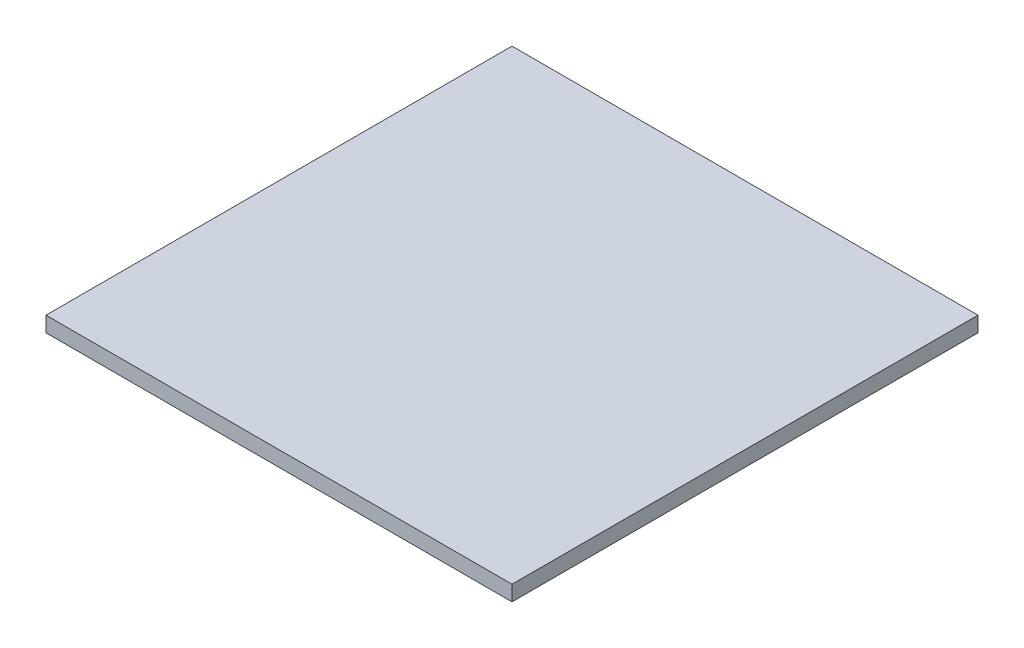
ISO-10303-21;
HEADER;
FILE_DESCRIPTION(('STEP AP214'),'2;1');
FILE_NAME('part.step','',(''),(''),'','','');
FILE_SCHEMA(('AUTOMOTIVE_DESIGN { 1 0 10303 214 1 1 1 1 }'));
ENDSEC;
DATA;
#1=APPLICATION_CONTEXT('core data for automotive mechanical design processes');
#2=APPLICATION_PROTOCOL_DEFINITION('international standard','automotive_design',2000,#1);
#3=PRODUCT_CONTEXT('',#1,'mechanical');
#4=PRODUCT('Part','Part','',(#3));
#5=PRODUCT_RELATED_PRODUCT_CATEGORY('part','',(#4));
#6=PRODUCT_DEFINITION_FORMATION('','',#4);
#7=PRODUCT_DEFINITION_CONTEXT('part definition',#1,'design');
#8=PRODUCT_DEFINITION('design','',#6,#7);
#9=PRODUCT_DEFINITION_SHAPE('','',#8);
#10=(LENGTH_UNIT() NAMED_UNIT(*) SI_UNIT(.MILLI.,.METRE.));
#11=(NAMED_UNIT(*) PLANE_ANGLE_UNIT() SI_UNIT($,.RADIAN.));
#12=(NAMED_UNIT(*) SI_UNIT($,.STERADIAN.) SOLID_ANGLE_UNIT());
#13=UNCERTAINTY_MEASURE_WITH_UNIT(LENGTH_MEASURE(1.E-05),#10,'distance_accuracy_value','');
#14=(GEOMETRIC_REPRESENTATION_CONTEXT(3) GLOBAL_UNCERTAINTY_ASSIGNED_CONTEXT((#13)) GLOBAL_UNIT_ASSIGNED_CONTEXT((#10,
#11,#12)) REPRESENTATION_CONTEXT('',''));
#15=CARTESIAN_POINT('',(0.,0.,0.));
#16=DIRECTION('',(0.,0.,1.));
#17=DIRECTION('',(1.,0.,0.));
#18=AXIS2_PLACEMENT_3D('',#15,#16,#17);
#19=CARTESIAN_POINT('',(152.4,10.,152.4));
#20=DIRECTION('',(-1.,0.,0.));
#21=DIRECTION('',(0.,0.,1.));
#22=AXIS2_PLACEMENT_3D('',#19,#20,#21);
#23=PLANE('',#22);
#24=DIRECTION('',(0.,0.,-1.));
#25=VECTOR('',#24,1.);
#26=CARTESIAN_POINT('',(152.4,0.,152.4));
#27=LINE('',#26,#25);
#28=CARTESIAN_POINT('',(152.4,0.,152.4));
#29=VERTEX_POINT('',#28);
#30=CARTESIAN_POINT('',(152.4,0.,-152.4));
#31=VERTEX_POINT('',#30);
#32=EDGE_CURVE('E104',#29,#31,#27,.T.);
#33=ORIENTED_EDGE('',*,*,#32,.T.);
#34=DIRECTION('',(0.,-1.,0.));
#35=VECTOR('',#34,1.);
#36=CARTESIAN_POINT('',(152.4,10.,-152.4));
#37=LINE('',#36,#35);
#38=CARTESIAN_POINT('',(152.4,10.,-152.4));
#39=VERTEX_POINT('',#38);
#40=EDGE_CURVE('E11',#39,#31,#37,.T.);
#41=ORIENTED_EDGE('',*,*,#40,.F.);
#42=DIRECTION('',(0.,0.,-1.));
#43=VECTOR('',#42,1.);
#44=CARTESIAN_POINT('',(152.4,10.,152.4));
#45=LINE('',#44,#43);
#46=CARTESIAN_POINT('',(152.4,10.,152.4));
#47=VERTEX_POINT('',#46);
#48=EDGE_CURVE('E92',#47,#39,#45,.T.);
#49=ORIENTED_EDGE('',*,*,#48,.F.);
#50=DIRECTION('',(0.,-1.,0.));
#51=VECTOR('',#50,1.);
#52=CARTESIAN_POINT('',(152.4,10.,152.4));
#53=LINE('',#52,#51);
#54=EDGE_CURVE('E100',#47,#29,#53,.T.);
#55=ORIENTED_EDGE('',*,*,#54,.T.);
#56=EDGE_LOOP('',(#33,#41,#49,#55));
#57=FACE_BOUND('',#56,.T.);
#58=ADVANCED_FACE('F41',(#57),#23,.F.);
#59=CARTESIAN_POINT('',(-152.4,10.,-152.4));
#60=DIRECTION('',(0.,0.,1.));
#61=DIRECTION('',(1.,0.,0.));
#62=AXIS2_PLACEMENT_3D('',#59,#60,#61);
#63=PLANE('',#62);
#64=DIRECTION('',(-1.,0.,0.));
#65=VECTOR('',#64,1.);
#66=CARTESIAN_POINT('',(-152.4,0.,-152.4));
#67=LINE('',#66,#65);
#68=CARTESIAN_POINT('',(-152.4,0.,-152.4));
#69=VERTEX_POINT('',#68);
#70=EDGE_CURVE('E96',#31,#69,#67,.T.);
#71=ORIENTED_EDGE('',*,*,#70,.T.);
#72=DIRECTION('',(0.,-1.,0.));
#73=VECTOR('',#72,1.);
#74=CARTESIAN_POINT('',(-152.4,10.,-152.4));
#75=LINE('',#74,#73);
#76=CARTESIAN_POINT('',(-152.4,10.,-152.4));
#77=VERTEX_POINT('',#76);
#78=EDGE_CURVE('E49',#77,#69,#75,.T.);
#79=ORIENTED_EDGE('',*,*,#78,.F.);
#80=DIRECTION('',(-1.,0.,0.));
#81=VECTOR('',#80,1.);
#82=CARTESIAN_POINT('',(-152.4,10.,-152.4));
#83=LINE('',#82,#81);
#84=EDGE_CURVE('E87',#39,#77,#83,.T.);
#85=ORIENTED_EDGE('',*,*,#84,.F.);
#86=ORIENTED_EDGE('',*,*,#40,.T.);
#87=EDGE_LOOP('',(#71,#79,#85,#86));
#88=FACE_BOUND('',#87,.T.);
#89=ADVANCED_FACE('F95',(#88),#63,.F.);
#90=CARTESIAN_POINT('',(-152.4,10.,152.4));
#91=DIRECTION('',(1.,0.,0.));
#92=DIRECTION('',(0.,0.,-1.));
#93=AXIS2_PLACEMENT_3D('',#90,#91,#92);
#94=PLANE('',#93);
#95=DIRECTION('',(0.,0.,1.));
#96=VECTOR('',#95,1.);
#97=CARTESIAN_POINT('',(-152.4,0.,152.4));
#98=LINE('',#97,#96);
#99=CARTESIAN_POINT('',(-152.4,0.,152.4));
#100=VERTEX_POINT('',#99);
#101=EDGE_CURVE('E74',#69,#100,#98,.T.);
#102=ORIENTED_EDGE('',*,*,#101,.T.);
#103=DIRECTION('',(0.,-1.,0.));
#104=VECTOR('',#103,1.);
#105=CARTESIAN_POINT('',(-152.4,10.,152.4));
#106=LINE('',#105,#104);
#107=CARTESIAN_POINT('',(-152.4,10.,152.4));
#108=VERTEX_POINT('',#107);
#109=EDGE_CURVE('E97',#108,#100,#106,.T.);
#110=ORIENTED_EDGE('',*,*,#109,.F.);
#111=DIRECTION('',(0.,0.,1.));
#112=VECTOR('',#111,1.);
#113=CARTESIAN_POINT('',(-152.4,10.,152.4));
#114=LINE('',#113,#112);
#115=EDGE_CURVE('E90',#77,#108,#114,.T.);
#116=ORIENTED_EDGE('',*,*,#115,.F.);
#117=ORIENTED_EDGE('',*,*,#78,.T.);
#118=EDGE_LOOP('',(#102,#110,#116,#117));
#119=FACE_BOUND('',#118,.T.);
#120=ADVANCED_FACE('F98',(#119),#94,.F.);
#121=CARTESIAN_POINT('',(-152.4,10.,152.4));
#122=DIRECTION('',(0.,0.,-1.));
#123=DIRECTION('',(-1.,0.,0.));
#124=AXIS2_PLACEMENT_3D('',#121,#122,#123);
#125=PLANE('',#124);
#126=DIRECTION('',(1.,0.,0.));
#127=VECTOR('',#126,1.);
#128=CARTESIAN_POINT('',(-152.4,0.,152.4));
#129=LINE('',#128,#127);
#130=EDGE_CURVE('E80',#100,#29,#129,.T.);
#131=ORIENTED_EDGE('',*,*,#130,.T.);
#132=ORIENTED_EDGE('',*,*,#54,.F.);
#133=DIRECTION('',(1.,0.,0.));
#134=VECTOR('',#133,1.);
#135=CARTESIAN_POINT('',(-152.4,10.,152.4));
#136=LINE('',#135,#134);
#137=EDGE_CURVE('E57',#108,#47,#136,.T.);
#138=ORIENTED_EDGE('',*,*,#137,.F.);
#139=ORIENTED_EDGE('',*,*,#109,.T.);
#140=EDGE_LOOP('',(#131,#132,#138,#139));
#141=FACE_BOUND('',#140,.T.);
#142=ADVANCED_FACE('F111',(#141),#125,.F.);
#143=CARTESIAN_POINT('',(0.,10.,0.));
#144=DIRECTION('',(0.,-1.,0.));
#145=DIRECTION('',(0.,0.,-1.));
#146=AXIS2_PLACEMENT_3D('',#143,#144,#145);
#147=PLANE('',#146);
#148=ORIENTED_EDGE('',*,*,#48,.T.);
#149=ORIENTED_EDGE('',*,*,#84,.T.);
#150=ORIENTED_EDGE('',*,*,#115,.T.);
#151=ORIENTED_EDGE('',*,*,#137,.T.);
#152=EDGE_LOOP('',(#148,#149,#150,#151));
#153=FACE_BOUND('',#152,.T.);
#154=ADVANCED_FACE('F88',(#153),#147,.F.);
#155=CARTESIAN_POINT('',(0.,0.,0.));
#156=DIRECTION('',(0.,-1.,0.));
#157=DIRECTION('',(0.,0.,-1.));
#158=AXIS2_PLACEMENT_3D('',#155,#156,#157);
#159=PLANE('',#158);
#160=ORIENTED_EDGE('',*,*,#32,.F.);
#161=ORIENTED_EDGE('',*,*,#130,.F.);
#162=ORIENTED_EDGE('',*,*,#101,.F.);
#163=ORIENTED_EDGE('',*,*,#70,.F.);
#164=EDGE_LOOP('',(#160,#161,#162,#163));
#165=FACE_BOUND('',#164,.T.);
#166=ADVANCED_FACE('F114',(#165),#159,.T.);
#167=CLOSED_SHELL('',(#58,#89,#120,#142,#154,#166));
#168=MANIFOLD_SOLID_BREP('B2',#167);
#169=ADVANCED_BREP_SHAPE_REPRESENTATION('',(#18,#168),#14);
#170=SHAPE_DEFINITION_REPRESENTATION(#9,#169);
ENDSEC;
END-ISO-10303-21;
